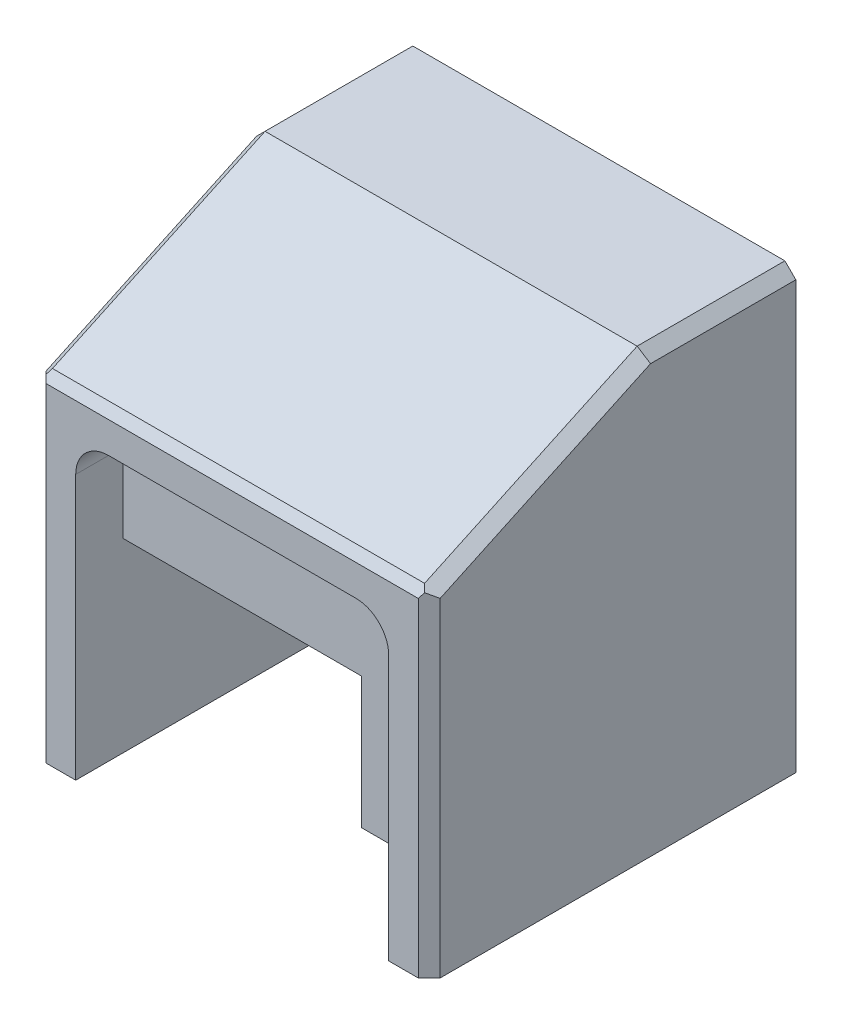
ISO-10303-21;
HEADER;
FILE_DESCRIPTION(('STEP AP214'),'2;1');
FILE_NAME('part.step','',(''),(''),'','','');
FILE_SCHEMA(('AUTOMOTIVE_DESIGN { 1 0 10303 214 1 1 1 1 }'));
ENDSEC;
DATA;
#1=APPLICATION_CONTEXT('core data for automotive mechanical design processes');
#2=APPLICATION_PROTOCOL_DEFINITION('international standard','automotive_design',2000,#1);
#3=PRODUCT_CONTEXT('',#1,'mechanical');
#4=PRODUCT('Part','Part','',(#3));
#5=PRODUCT_RELATED_PRODUCT_CATEGORY('part','',(#4));
#6=PRODUCT_DEFINITION_FORMATION('','',#4);
#7=PRODUCT_DEFINITION_CONTEXT('part definition',#1,'design');
#8=PRODUCT_DEFINITION('design','',#6,#7);
#9=PRODUCT_DEFINITION_SHAPE('','',#8);
#10=(LENGTH_UNIT() NAMED_UNIT(*) SI_UNIT(.MILLI.,.METRE.));
#11=(NAMED_UNIT(*) PLANE_ANGLE_UNIT() SI_UNIT($,.RADIAN.));
#12=(NAMED_UNIT(*) SI_UNIT($,.STERADIAN.) SOLID_ANGLE_UNIT());
#13=UNCERTAINTY_MEASURE_WITH_UNIT(LENGTH_MEASURE(1.E-05),#10,'distance_accuracy_value','');
#14=(GEOMETRIC_REPRESENTATION_CONTEXT(3) GLOBAL_UNCERTAINTY_ASSIGNED_CONTEXT((#13)) GLOBAL_UNIT_ASSIGNED_CONTEXT((#10,
#11,#12)) REPRESENTATION_CONTEXT('',''));
#15=CARTESIAN_POINT('',(0.,0.,0.));
#16=DIRECTION('',(0.,0.,1.));
#17=DIRECTION('',(1.,0.,0.));
#18=AXIS2_PLACEMENT_3D('',#15,#16,#17);
#19=CARTESIAN_POINT('',(0.,31.59892297446,3.));
#20=DIRECTION('',(0.,-0.906307787036659,-0.422618261740681));
#21=DIRECTION('',(0.,0.422618261740681,-0.906307787036659));
#22=AXIS2_PLACEMENT_3D('',#19,#20,#21);
#23=PLANE('',#22);
#24=DIRECTION('',(0.,-0.422618261740681,0.906307787036659));
#25=VECTOR('',#24,1.);
#26=CARTESIAN_POINT('',(-14.3,32.99784594893,0.));
#27=LINE('',#26,#25);
#28=CARTESIAN_POINT('',(-14.3,32.99784594893,0.));
#29=VERTEX_POINT('',#28);
#30=CARTESIAN_POINT('',(-14.3,30.2,6.));
#31=VERTEX_POINT('',#30);
#32=EDGE_CURVE('E411',#29,#31,#27,.T.);
#33=ORIENTED_EDGE('',*,*,#32,.F.);
#34=DIRECTION('',(-1.,0.,0.));
#35=VECTOR('',#34,1.);
#36=CARTESIAN_POINT('',(14.3,32.99784594893,0.));
#37=LINE('',#36,#35);
#38=CARTESIAN_POINT('',(14.3,32.99784594893,0.));
#39=VERTEX_POINT('',#38);
#40=EDGE_CURVE('E345',#39,#29,#37,.T.);
#41=ORIENTED_EDGE('',*,*,#40,.F.);
#42=DIRECTION('',(0.,0.422618261740681,-0.906307787036659));
#43=VECTOR('',#42,1.);
#44=CARTESIAN_POINT('',(14.3,30.2,6.));
#45=LINE('',#44,#43);
#46=CARTESIAN_POINT('',(14.3,30.2,6.));
#47=VERTEX_POINT('',#46);
#48=EDGE_CURVE('E488',#47,#39,#45,.T.);
#49=ORIENTED_EDGE('',*,*,#48,.F.);
#50=DIRECTION('',(-1.,0.,0.));
#51=VECTOR('',#50,1.);
#52=CARTESIAN_POINT('',(14.3,30.2,6.));
#53=LINE('',#52,#51);
#54=EDGE_CURVE('E10',#47,#31,#53,.T.);
#55=ORIENTED_EDGE('',*,*,#54,.T.);
#56=EDGE_LOOP('',(#33,#41,#49,#55));
#57=FACE_BOUND('',#56,.T.);
#58=ADVANCED_FACE('F16',(#57),#23,.T.);
#59=CARTESIAN_POINT('',(-14.3,30.2,0.));
#60=DIRECTION('',(0.,1.,0.));
#61=DIRECTION('',(1.,0.,0.));
#62=AXIS2_PLACEMENT_3D('',#59,#60,#61);
#63=PLANE('',#62);
#64=DIRECTION('',(0.,0.,1.));
#65=VECTOR('',#64,1.);
#66=CARTESIAN_POINT('',(14.3,30.2,6.));
#67=LINE('',#66,#65);
#68=CARTESIAN_POINT('',(14.3,30.2,11.));
#69=VERTEX_POINT('',#68);
#70=EDGE_CURVE('E453',#47,#69,#67,.T.);
#71=ORIENTED_EDGE('',*,*,#70,.T.);
#72=DIRECTION('',(1.,0.,0.));
#73=VECTOR('',#72,1.);
#74=CARTESIAN_POINT('',(-14.3,30.2,11.));
#75=LINE('',#74,#73);
#76=CARTESIAN_POINT('',(-14.3,30.2,11.));
#77=VERTEX_POINT('',#76);
#78=EDGE_CURVE('E542',#77,#69,#75,.T.);
#79=ORIENTED_EDGE('',*,*,#78,.F.);
#80=DIRECTION('',(0.,0.,1.));
#81=VECTOR('',#80,1.);
#82=CARTESIAN_POINT('',(-14.3,30.2,6.));
#83=LINE('',#82,#81);
#84=EDGE_CURVE('E392',#31,#77,#83,.T.);
#85=ORIENTED_EDGE('',*,*,#84,.F.);
#86=ORIENTED_EDGE('',*,*,#54,.F.);
#87=EDGE_LOOP('',(#71,#79,#85,#86));
#88=FACE_BOUND('',#87,.T.);
#89=ADVANCED_FACE('F905',(#88),#63,.F.);
#90=CARTESIAN_POINT('',(0.,25.48993046961,33.21130913087));
#91=DIRECTION('',(0.,0.537299608346801,0.843391445812901));
#92=DIRECTION('',(1.,0.,0.));
#93=AXIS2_PLACEMENT_3D('',#90,#91,#92);
#94=PLANE('',#93);
#95=DIRECTION('',(-0.473306150771121,-0.742941838426434,0.473306150771121));
#96=VECTOR('',#95,1.);
#97=CARTESIAN_POINT('',(-17.,25.94308436313,32.92261826174));
#98=LINE('',#97,#96);
#99=CARTESIAN_POINT('',(-17.,25.94308436313,32.92261826174));
#100=VERTEX_POINT('',#99);
#101=CARTESIAN_POINT('',(-17.28869086913,25.48993046961,33.21130913087));
#102=VERTEX_POINT('',#101);
#103=EDGE_CURVE('E405',#100,#102,#98,.T.);
#104=ORIENTED_EDGE('',*,*,#103,.T.);
#105=DIRECTION('',(0.473306150771121,-0.742941838426434,0.473306150771121));
#106=VECTOR('',#105,1.);
#107=CARTESIAN_POINT('',(-17.28869086913,25.48993046961,33.21130913087));
#108=LINE('',#107,#106);
#109=CARTESIAN_POINT('',(-17.,25.03677657609,33.5));
#110=VERTEX_POINT('',#109);
#111=EDGE_CURVE('E465',#102,#110,#108,.T.);
#112=ORIENTED_EDGE('',*,*,#111,.T.);
#113=DIRECTION('',(-1.,0.,0.));
#114=VECTOR('',#113,1.);
#115=CARTESIAN_POINT('',(17.,25.03677657609,33.5));
#116=LINE('',#115,#114);
#117=CARTESIAN_POINT('',(17.,25.03677657609,33.5));
#118=VERTEX_POINT('',#117);
#119=EDGE_CURVE('E346',#118,#110,#116,.T.);
#120=ORIENTED_EDGE('',*,*,#119,.F.);
#121=DIRECTION('',(0.473306150771121,0.742941838426434,-0.473306150771121));
#122=VECTOR('',#121,1.);
#123=CARTESIAN_POINT('',(17.,25.03677657609,33.5));
#124=LINE('',#123,#122);
#125=CARTESIAN_POINT('',(17.28869086913,25.48993046961,33.21130913087));
#126=VERTEX_POINT('',#125);
#127=EDGE_CURVE('E420',#118,#126,#124,.T.);
#128=ORIENTED_EDGE('',*,*,#127,.T.);
#129=DIRECTION('',(0.473306150771121,-0.742941838426434,0.473306150771121));
#130=VECTOR('',#129,1.);
#131=CARTESIAN_POINT('',(17.,25.94308436313,32.92261826174));
#132=LINE('',#131,#130);
#133=CARTESIAN_POINT('',(17.,25.94308436313,32.92261826174));
#134=VERTEX_POINT('',#133);
#135=EDGE_CURVE('E25',#134,#126,#132,.T.);
#136=ORIENTED_EDGE('',*,*,#135,.F.);
#137=DIRECTION('',(-1.,0.,0.));
#138=VECTOR('',#137,1.);
#139=CARTESIAN_POINT('',(17.,25.94308436313,32.92261826174));
#140=LINE('',#139,#138);
#141=EDGE_CURVE('E44',#134,#100,#140,.T.);
#142=ORIENTED_EDGE('',*,*,#141,.T.);
#143=EDGE_LOOP('',(#104,#112,#120,#128,#136,#142));
#144=FACE_BOUND('',#143,.T.);
#145=ADVANCED_FACE('F636',(#144),#94,.T.);
#146=CARTESIAN_POINT('',(17.5,29.88376952493,23.28869086913));
#147=DIRECTION('',(0.707106781186523,0.640856382055821,0.298836238730109));
#148=DIRECTION('',(0.,0.422618261740671,-0.906307787036664));
#149=AXIS2_PLACEMENT_3D('',#146,#147,#148);
#150=PLANE('',#149);
#151=ORIENTED_EDGE('',*,*,#135,.T.);
#152=DIRECTION('',(0.644710818692427,-0.410726089409818,-0.644710818692427));
#153=VECTOR('',#152,1.);
#154=CARTESIAN_POINT('',(17.28869086913,25.48993046961,33.21130913087));
#155=LINE('',#154,#153);
#156=CARTESIAN_POINT('',(18.,25.03677657609,32.5));
#157=VERTEX_POINT('',#156);
#158=EDGE_CURVE('E424',#126,#157,#155,.T.);
#159=ORIENTED_EDGE('',*,*,#158,.T.);
#160=DIRECTION('',(0.,-0.422618261740681,0.906307787036659));
#161=VECTOR('',#160,1.);
#162=CARTESIAN_POINT('',(18.,34.,13.27830533736));
#163=LINE('',#162,#161);
#164=CARTESIAN_POINT('',(18.,34.,13.27830533736));
#165=VERTEX_POINT('',#164);
#166=EDGE_CURVE('E415',#165,#157,#163,.T.);
#167=ORIENTED_EDGE('',*,*,#166,.F.);
#168=DIRECTION('',(0.698575389024277,-0.698575389024277,-0.154870435200395));
#169=VECTOR('',#168,1.);
#170=CARTESIAN_POINT('',(17.,35.,13.5));
#171=LINE('',#170,#169);
#172=CARTESIAN_POINT('',(17.,35.,13.5));
#173=VERTEX_POINT('',#172);
#174=EDGE_CURVE('E290',#173,#165,#171,.T.);
#175=ORIENTED_EDGE('',*,*,#174,.F.);
#176=DIRECTION('',(0.,-0.422618261740681,0.906307787036659));
#177=VECTOR('',#176,1.);
#178=CARTESIAN_POINT('',(17.,35.,13.5));
#179=LINE('',#178,#177);
#180=EDGE_CURVE('E476',#173,#134,#179,.T.);
#181=ORIENTED_EDGE('',*,*,#180,.T.);
#182=EDGE_LOOP('',(#151,#159,#167,#175,#181));
#183=FACE_BOUND('',#182,.T.);
#184=ADVANCED_FACE('F646',(#183),#150,.T.);
#185=CARTESIAN_POINT('',(0.,30.33692341845,23.5));
#186=DIRECTION('',(0.,0.906307787036659,0.422618261740681));
#187=DIRECTION('',(1.,0.,0.));
#188=AXIS2_PLACEMENT_3D('',#185,#186,#187);
#189=PLANE('',#188);
#190=ORIENTED_EDGE('',*,*,#141,.F.);
#191=ORIENTED_EDGE('',*,*,#180,.F.);
#192=DIRECTION('',(-1.,0.,0.));
#193=VECTOR('',#192,1.);
#194=CARTESIAN_POINT('',(17.,35.,13.5));
#195=LINE('',#194,#193);
#196=CARTESIAN_POINT('',(-17.,35.,13.5));
#197=VERTEX_POINT('',#196);
#198=EDGE_CURVE('E286',#173,#197,#195,.T.);
#199=ORIENTED_EDGE('',*,*,#198,.T.);
#200=DIRECTION('',(0.,0.422618261740719,-0.906307787036641));
#201=VECTOR('',#200,1.);
#202=CARTESIAN_POINT('',(-17.,25.94308436313,32.92261826174));
#203=LINE('',#202,#201);
#204=EDGE_CURVE('E19',#100,#197,#203,.T.);
#205=ORIENTED_EDGE('',*,*,#204,.F.);
#206=EDGE_LOOP('',(#190,#191,#199,#205));
#207=FACE_BOUND('',#206,.T.);
#208=ADVANCED_FACE('F649',(#207),#189,.T.);
#209=CARTESIAN_POINT('',(-17.5,29.88376952493,23.28869086913));
#210=DIRECTION('',(-0.707106781186523,0.640856382055821,0.298836238730109));
#211=DIRECTION('',(0.389281620635025,0.,0.921118787038766));
#212=AXIS2_PLACEMENT_3D('',#209,#210,#211);
#213=PLANE('',#212);
#214=DIRECTION('',(0.644710818692427,0.410726089409818,0.644710818692427));
#215=VECTOR('',#214,1.);
#216=CARTESIAN_POINT('',(-18.,25.03677657609,32.5));
#217=LINE('',#216,#215);
#218=CARTESIAN_POINT('',(-18.,25.03677657609,32.5));
#219=VERTEX_POINT('',#218);
#220=EDGE_CURVE('E557',#219,#102,#217,.T.);
#221=ORIENTED_EDGE('',*,*,#220,.T.);
#222=ORIENTED_EDGE('',*,*,#103,.F.);
#223=ORIENTED_EDGE('',*,*,#204,.T.);
#224=DIRECTION('',(-0.698575389024277,-0.698575389024277,-0.154870435200395));
#225=VECTOR('',#224,1.);
#226=CARTESIAN_POINT('',(-17.,35.,13.5));
#227=LINE('',#226,#225);
#228=CARTESIAN_POINT('',(-18.,34.,13.27830533736));
#229=VERTEX_POINT('',#228);
#230=EDGE_CURVE('E371',#197,#229,#227,.T.);
#231=ORIENTED_EDGE('',*,*,#230,.T.);
#232=DIRECTION('',(0.,0.422618261740681,-0.906307787036659));
#233=VECTOR('',#232,1.);
#234=CARTESIAN_POINT('',(-18.,25.03677657609,32.5));
#235=LINE('',#234,#233);
#236=EDGE_CURVE('E408',#219,#229,#235,.T.);
#237=ORIENTED_EDGE('',*,*,#236,.F.);
#238=EDGE_LOOP('',(#221,#222,#223,#231,#237));
#239=FACE_BOUND('',#238,.T.);
#240=ADVANCED_FACE('F624',(#239),#213,.T.);
#241=CARTESIAN_POINT('',(-18.,35.,0.));
#242=DIRECTION('',(-1.,0.,0.));
#243=DIRECTION('',(0.,0.,1.));
#244=AXIS2_PLACEMENT_3D('',#241,#242,#243);
#245=PLANE('',#244);
#246=ORIENTED_EDGE('',*,*,#236,.T.);
#247=DIRECTION('',(0.,0.,-1.));
#248=VECTOR('',#247,1.);
#249=CARTESIAN_POINT('',(-18.,34.,13.27830533736));
#250=LINE('',#249,#248);
#251=CARTESIAN_POINT('',(-18.,34.,0.));
#252=VERTEX_POINT('',#251);
#253=EDGE_CURVE('E376',#229,#252,#250,.T.);
#254=ORIENTED_EDGE('',*,*,#253,.T.);
#255=DIRECTION('',(0.,1.,0.));
#256=VECTOR('',#255,1.);
#257=CARTESIAN_POINT('',(-18.,-5.,0.));
#258=LINE('',#257,#256);
#259=CARTESIAN_POINT('',(-18.,-5.,0.));
#260=VERTEX_POINT('',#259);
#261=EDGE_CURVE('E356',#260,#252,#258,.T.);
#262=ORIENTED_EDGE('',*,*,#261,.F.);
#263=DIRECTION('',(0.,0.,-1.));
#264=VECTOR('',#263,1.);
#265=CARTESIAN_POINT('',(-18.,-5.,32.5));
#266=LINE('',#265,#264);
#267=CARTESIAN_POINT('',(-18.,-5.,32.5));
#268=VERTEX_POINT('',#267);
#269=EDGE_CURVE('E444',#268,#260,#266,.T.);
#270=ORIENTED_EDGE('',*,*,#269,.F.);
#271=DIRECTION('',(0.,1.,0.));
#272=VECTOR('',#271,1.);
#273=CARTESIAN_POINT('',(-18.,-5.,32.5));
#274=LINE('',#273,#272);
#275=EDGE_CURVE('E561',#268,#219,#274,.T.);
#276=ORIENTED_EDGE('',*,*,#275,.T.);
#277=EDGE_LOOP('',(#246,#254,#262,#270,#276));
#278=FACE_BOUND('',#277,.T.);
#279=ADVANCED_FACE('F617',(#278),#245,.T.);
#280=CARTESIAN_POINT('',(-17.5,10.33692341845,33.));
#281=DIRECTION('',(-0.707106781186548,0.,0.707106781186548));
#282=DIRECTION('',(0.,1.,0.));
#283=AXIS2_PLACEMENT_3D('',#280,#281,#282);
#284=PLANE('',#283);
#285=DIRECTION('',(0.,1.,0.));
#286=VECTOR('',#285,1.);
#287=CARTESIAN_POINT('',(-17.,-5.,33.5));
#288=LINE('',#287,#286);
#289=CARTESIAN_POINT('',(-17.,-5.,33.5));
#290=VERTEX_POINT('',#289);
#291=EDGE_CURVE('E350',#290,#110,#288,.T.);
#292=ORIENTED_EDGE('',*,*,#291,.T.);
#293=ORIENTED_EDGE('',*,*,#111,.F.);
#294=ORIENTED_EDGE('',*,*,#220,.F.);
#295=ORIENTED_EDGE('',*,*,#275,.F.);
#296=DIRECTION('',(-0.707106781186548,0.,-0.707106781186548));
#297=VECTOR('',#296,1.);
#298=CARTESIAN_POINT('',(-17.,-5.,33.5));
#299=LINE('',#298,#297);
#300=EDGE_CURVE('E469',#290,#268,#299,.T.);
#301=ORIENTED_EDGE('',*,*,#300,.F.);
#302=EDGE_LOOP('',(#292,#293,#294,#295,#301));
#303=FACE_BOUND('',#302,.T.);
#304=ADVANCED_FACE('F634',(#303),#284,.T.);
#305=CARTESIAN_POINT('',(-14.3,22.2,29.2));
#306=DIRECTION('',(0.,-1.,0.));
#307=DIRECTION('',(0.,0.,-1.));
#308=AXIS2_PLACEMENT_3D('',#305,#306,#307);
#309=PLANE('',#308);
#310=DIRECTION('',(1.,0.,0.));
#311=VECTOR('',#310,1.);
#312=CARTESIAN_POINT('',(-11.3,22.2,33.5));
#313=LINE('',#312,#311);
#314=CARTESIAN_POINT('',(-11.3,22.2,33.5));
#315=VERTEX_POINT('',#314);
#316=CARTESIAN_POINT('',(11.3,22.2,33.5));
#317=VERTEX_POINT('',#316);
#318=EDGE_CURVE('E535',#315,#317,#313,.T.);
#319=ORIENTED_EDGE('',*,*,#318,.F.);
#320=DIRECTION('',(0.,0.,1.));
#321=VECTOR('',#320,1.);
#322=CARTESIAN_POINT('',(-11.3,22.2,29.2));
#323=LINE('',#322,#321);
#324=CARTESIAN_POINT('',(-11.3,22.2,29.2));
#325=VERTEX_POINT('',#324);
#326=EDGE_CURVE('E462',#325,#315,#323,.T.);
#327=ORIENTED_EDGE('',*,*,#326,.F.);
#328=DIRECTION('',(1.,0.,0.));
#329=VECTOR('',#328,1.);
#330=CARTESIAN_POINT('',(-11.3,22.2,29.2));
#331=LINE('',#330,#329);
#332=CARTESIAN_POINT('',(11.3,22.2,29.2));
#333=VERTEX_POINT('',#332);
#334=EDGE_CURVE('E573',#325,#333,#331,.T.);
#335=ORIENTED_EDGE('',*,*,#334,.T.);
#336=DIRECTION('',(0.,0.,1.));
#337=VECTOR('',#336,1.);
#338=CARTESIAN_POINT('',(11.3,22.2,29.2));
#339=LINE('',#338,#337);
#340=EDGE_CURVE('E493',#333,#317,#339,.T.);
#341=ORIENTED_EDGE('',*,*,#340,.T.);
#342=EDGE_LOOP('',(#319,#327,#335,#341));
#343=FACE_BOUND('',#342,.T.);
#344=ADVANCED_FACE('F840',(#343),#309,.T.);
#345=CARTESIAN_POINT('',(-11.3,19.2,-43.6706));
#346=DIRECTION('',(0.,0.,1.));
#347=DIRECTION('',(0.,1.,0.));
#348=AXIS2_PLACEMENT_3D('',#345,#346,#347);
#349=CYLINDRICAL_SURFACE('',#348,3.);
#350=CARTESIAN_POINT('',(-11.3,19.2,33.5));
#351=DIRECTION('',(0.,0.,-1.));
#352=DIRECTION('',(-1.,0.,0.));
#353=AXIS2_PLACEMENT_3D('',#350,#351,#352);
#354=CIRCLE('',#353,3.);
#355=CARTESIAN_POINT('',(-14.3,19.2,33.5));
#356=VERTEX_POINT('',#355);
#357=EDGE_CURVE('E582',#356,#315,#354,.T.);
#358=ORIENTED_EDGE('',*,*,#357,.F.);
#359=DIRECTION('',(0.,0.,1.));
#360=VECTOR('',#359,1.);
#361=CARTESIAN_POINT('',(-14.3,19.2,29.2));
#362=LINE('',#361,#360);
#363=CARTESIAN_POINT('',(-14.3,19.2,29.2));
#364=VERTEX_POINT('',#363);
#365=EDGE_CURVE('E513',#364,#356,#362,.T.);
#366=ORIENTED_EDGE('',*,*,#365,.F.);
#367=CARTESIAN_POINT('',(-11.3,19.2,29.2));
#368=DIRECTION('',(0.,0.,1.));
#369=DIRECTION('',(0.,1.,0.));
#370=AXIS2_PLACEMENT_3D('',#367,#368,#369);
#371=CIRCLE('',#370,3.);
#372=EDGE_CURVE('E529',#325,#364,#371,.T.);
#373=ORIENTED_EDGE('',*,*,#372,.F.);
#374=ORIENTED_EDGE('',*,*,#326,.T.);
#375=EDGE_LOOP('',(#358,#366,#373,#374));
#376=FACE_BOUND('',#375,.T.);
#377=ADVANCED_FACE('F863',(#376),#349,.F.);
#378=CARTESIAN_POINT('',(-14.3,0.,17.2));
#379=DIRECTION('',(0.,0.,-1.));
#380=DIRECTION('',(0.,-1.,0.));
#381=AXIS2_PLACEMENT_3D('',#378,#379,#380);
#382=PLANE('',#381);
#383=DIRECTION('',(0.,1.,0.));
#384=VECTOR('',#383,1.);
#385=CARTESIAN_POINT('',(-7.5,0.,17.2));
#386=LINE('',#385,#384);
#387=CARTESIAN_POINT('',(-7.5,0.,17.2));
#388=VERTEX_POINT('',#387);
#389=CARTESIAN_POINT('',(-7.5,12.,17.2));
#390=VERTEX_POINT('',#389);
#391=EDGE_CURVE('E448',#388,#390,#386,.T.);
#392=ORIENTED_EDGE('',*,*,#391,.T.);
#393=DIRECTION('',(1.,0.,0.));
#394=VECTOR('',#393,1.);
#395=CARTESIAN_POINT('',(-14.3,12.,17.2));
#396=LINE('',#395,#394);
#397=CARTESIAN_POINT('',(-14.3,12.,17.2));
#398=VERTEX_POINT('',#397);
#399=EDGE_CURVE('E328',#398,#390,#396,.T.);
#400=ORIENTED_EDGE('',*,*,#399,.F.);
#401=DIRECTION('',(0.,1.,0.));
#402=VECTOR('',#401,1.);
#403=CARTESIAN_POINT('',(-14.3,0.,17.2));
#404=LINE('',#403,#402);
#405=CARTESIAN_POINT('',(-14.3,0.,17.2));
#406=VERTEX_POINT('',#405);
#407=EDGE_CURVE('E387',#406,#398,#404,.T.);
#408=ORIENTED_EDGE('',*,*,#407,.F.);
#409=DIRECTION('',(1.,0.,0.));
#410=VECTOR('',#409,1.);
#411=CARTESIAN_POINT('',(-14.3,0.,17.2));
#412=LINE('',#411,#410);
#413=EDGE_CURVE('E365',#406,#388,#412,.T.);
#414=ORIENTED_EDGE('',*,*,#413,.T.);
#415=EDGE_LOOP('',(#392,#400,#408,#414));
#416=FACE_BOUND('',#415,.T.);
#417=ADVANCED_FACE('F811',(#416),#382,.F.);
#418=CARTESIAN_POINT('',(-7.5,12.,29.2));
#419=DIRECTION('',(-1.,0.,0.));
#420=DIRECTION('',(0.,0.,1.));
#421=AXIS2_PLACEMENT_3D('',#418,#419,#420);
#422=PLANE('',#421);
#423=DIRECTION('',(0.,0.,1.));
#424=VECTOR('',#423,1.);
#425=CARTESIAN_POINT('',(-7.5,0.,11.));
#426=LINE('',#425,#424);
#427=CARTESIAN_POINT('',(-7.5,0.,11.));
#428=VERTEX_POINT('',#427);
#429=EDGE_CURVE('E396',#428,#388,#426,.T.);
#430=ORIENTED_EDGE('',*,*,#429,.F.);
#431=DIRECTION('',(0.,-1.,0.));
#432=VECTOR('',#431,1.);
#433=CARTESIAN_POINT('',(-7.5,29.,11.));
#434=LINE('',#433,#432);
#435=CARTESIAN_POINT('',(-7.5,29.,11.));
#436=VERTEX_POINT('',#435);
#437=EDGE_CURVE('E550',#436,#428,#434,.T.);
#438=ORIENTED_EDGE('',*,*,#437,.F.);
#439=DIRECTION('',(0.,-0.707106781186548,0.707106781186548));
#440=VECTOR('',#439,1.);
#441=CARTESIAN_POINT('',(-7.5,29.,11.));
#442=LINE('',#441,#440);
#443=CARTESIAN_POINT('',(-7.5,12.,28.));
#444=VERTEX_POINT('',#443);
#445=EDGE_CURVE('E520',#436,#444,#442,.T.);
#446=ORIENTED_EDGE('',*,*,#445,.T.);
#447=DIRECTION('',(0.,0.,-1.));
#448=VECTOR('',#447,1.);
#449=CARTESIAN_POINT('',(-7.5,12.,28.));
#450=LINE('',#449,#448);
#451=EDGE_CURVE('E332',#444,#390,#450,.T.);
#452=ORIENTED_EDGE('',*,*,#451,.T.);
#453=ORIENTED_EDGE('',*,*,#391,.F.);
#454=EDGE_LOOP('',(#430,#438,#446,#452,#453));
#455=FACE_BOUND('',#454,.T.);
#456=ADVANCED_FACE('F805',(#455),#422,.F.);
#457=CARTESIAN_POINT('',(7.5,12.,29.2));
#458=DIRECTION('',(0.,1.,0.));
#459=DIRECTION('',(1.,0.,0.));
#460=AXIS2_PLACEMENT_3D('',#457,#458,#459);
#461=PLANE('',#460);
#462=ORIENTED_EDGE('',*,*,#399,.T.);
#463=ORIENTED_EDGE('',*,*,#451,.F.);
#464=DIRECTION('',(-1.,0.,0.));
#465=VECTOR('',#464,1.);
#466=CARTESIAN_POINT('',(7.5,12.,28.));
#467=LINE('',#466,#465);
#468=CARTESIAN_POINT('',(7.5,12.,28.));
#469=VERTEX_POINT('',#468);
#470=EDGE_CURVE('E333',#469,#444,#467,.T.);
#471=ORIENTED_EDGE('',*,*,#470,.F.);
#472=DIRECTION('',(0.,0.,-1.));
#473=VECTOR('',#472,1.);
#474=CARTESIAN_POINT('',(7.5,12.,29.2));
#475=LINE('',#474,#473);
#476=CARTESIAN_POINT('',(7.5,12.,29.2));
#477=VERTEX_POINT('',#476);
#478=EDGE_CURVE('E597',#477,#469,#475,.T.);
#479=ORIENTED_EDGE('',*,*,#478,.F.);
#480=DIRECTION('',(1.,0.,0.));
#481=VECTOR('',#480,1.);
#482=CARTESIAN_POINT('',(-14.3,12.,29.2));
#483=LINE('',#482,#481);
#484=CARTESIAN_POINT('',(-14.3,12.,29.2));
#485=VERTEX_POINT('',#484);
#486=EDGE_CURVE('E524',#485,#477,#483,.T.);
#487=ORIENTED_EDGE('',*,*,#486,.F.);
#488=DIRECTION('',(0.,0.,-1.));
#489=VECTOR('',#488,1.);
#490=CARTESIAN_POINT('',(-14.3,12.,29.2));
#491=LINE('',#490,#489);
#492=EDGE_CURVE('E391',#485,#398,#491,.T.);
#493=ORIENTED_EDGE('',*,*,#492,.T.);
#494=EDGE_LOOP('',(#462,#463,#471,#479,#487,#493));
#495=FACE_BOUND('',#494,.T.);
#496=ADVANCED_FACE('F810',(#495),#461,.F.);
#497=CARTESIAN_POINT('',(0.,20.5,19.5));
#498=DIRECTION('',(0.,-0.707106781186548,-0.707106781186548));
#499=DIRECTION('',(0.,-0.707106781186548,0.707106781186548));
#500=AXIS2_PLACEMENT_3D('',#497,#498,#499);
#501=PLANE('',#500);
#502=ORIENTED_EDGE('',*,*,#445,.F.);
#503=DIRECTION('',(-1.,0.,0.));
#504=VECTOR('',#503,1.);
#505=CARTESIAN_POINT('',(7.5,29.,11.));
#506=LINE('',#505,#504);
#507=CARTESIAN_POINT('',(7.5,29.,11.));
#508=VERTEX_POINT('',#507);
#509=EDGE_CURVE('E546',#508,#436,#506,.T.);
#510=ORIENTED_EDGE('',*,*,#509,.F.);
#511=DIRECTION('',(0.,0.707106781186548,-0.707106781186548));
#512=VECTOR('',#511,1.);
#513=CARTESIAN_POINT('',(7.5,12.,28.));
#514=LINE('',#513,#512);
#515=EDGE_CURVE('E601',#469,#508,#514,.T.);
#516=ORIENTED_EDGE('',*,*,#515,.F.);
#517=ORIENTED_EDGE('',*,*,#470,.T.);
#518=EDGE_LOOP('',(#502,#510,#516,#517));
#519=FACE_BOUND('',#518,.T.);
#520=ADVANCED_FACE('F830',(#519),#501,.T.);
#521=CARTESIAN_POINT('',(7.5,0.,29.2));
#522=DIRECTION('',(1.,0.,0.));
#523=DIRECTION('',(0.,1.,0.));
#524=AXIS2_PLACEMENT_3D('',#521,#522,#523);
#525=PLANE('',#524);
#526=DIRECTION('',(0.,0.,1.));
#527=VECTOR('',#526,1.);
#528=CARTESIAN_POINT('',(7.5,0.,23.));
#529=LINE('',#528,#527);
#530=CARTESIAN_POINT('',(7.5,0.,23.));
#531=VERTEX_POINT('',#530);
#532=CARTESIAN_POINT('',(7.5,0.,29.2));
#533=VERTEX_POINT('',#532);
#534=EDGE_CURVE('E336',#531,#533,#529,.T.);
#535=ORIENTED_EDGE('',*,*,#534,.T.);
#536=DIRECTION('',(0.,1.,0.));
#537=VECTOR('',#536,1.);
#538=CARTESIAN_POINT('',(7.5,0.,29.2));
#539=LINE('',#538,#537);
#540=EDGE_CURVE('E528',#533,#477,#539,.T.);
#541=ORIENTED_EDGE('',*,*,#540,.T.);
#542=ORIENTED_EDGE('',*,*,#478,.T.);
#543=ORIENTED_EDGE('',*,*,#515,.T.);
#544=DIRECTION('',(0.,1.,0.));
#545=VECTOR('',#544,1.);
#546=CARTESIAN_POINT('',(7.5,12.,11.));
#547=LINE('',#546,#545);
#548=CARTESIAN_POINT('',(7.5,12.,11.));
#549=VERTEX_POINT('',#548);
#550=EDGE_CURVE('E545',#549,#508,#547,.T.);
#551=ORIENTED_EDGE('',*,*,#550,.F.);
#552=DIRECTION('',(0.,0.,1.));
#553=VECTOR('',#552,1.);
#554=CARTESIAN_POINT('',(7.5,12.,11.));
#555=LINE('',#554,#553);
#556=CARTESIAN_POINT('',(7.5,12.,23.));
#557=VERTEX_POINT('',#556);
#558=EDGE_CURVE('E317',#549,#557,#555,.T.);
#559=ORIENTED_EDGE('',*,*,#558,.T.);
#560=DIRECTION('',(0.,1.,0.));
#561=VECTOR('',#560,1.);
#562=CARTESIAN_POINT('',(7.5,0.,23.));
#563=LINE('',#562,#561);
#564=EDGE_CURVE('E318',#531,#557,#563,.T.);
#565=ORIENTED_EDGE('',*,*,#564,.F.);
#566=EDGE_LOOP('',(#535,#541,#542,#543,#551,#559,#565));
#567=FACE_BOUND('',#566,.T.);
#568=ADVANCED_FACE('F821',(#567),#525,.F.);
#569=CARTESIAN_POINT('',(0.,0.,29.2));
#570=DIRECTION('',(0.,0.,1.));
#571=DIRECTION('',(1.,0.,0.));
#572=AXIS2_PLACEMENT_3D('',#569,#570,#571);
#573=PLANE('',#572);
#574=DIRECTION('',(0.,1.,0.));
#575=VECTOR('',#574,1.);
#576=CARTESIAN_POINT('',(14.3,0.,29.2));
#577=LINE('',#576,#575);
#578=CARTESIAN_POINT('',(14.3,0.,29.2));
#579=VERTEX_POINT('',#578);
#580=CARTESIAN_POINT('',(14.3,19.2,29.2));
#581=VERTEX_POINT('',#580);
#582=EDGE_CURVE('E385',#579,#581,#577,.T.);
#583=ORIENTED_EDGE('',*,*,#582,.T.);
#584=CARTESIAN_POINT('',(11.3,19.2,29.2));
#585=DIRECTION('',(0.,0.,1.));
#586=DIRECTION('',(1.,0.,0.));
#587=AXIS2_PLACEMENT_3D('',#584,#585,#586);
#588=CIRCLE('',#587,3.);
#589=EDGE_CURVE('E496',#581,#333,#588,.T.);
#590=ORIENTED_EDGE('',*,*,#589,.T.);
#591=ORIENTED_EDGE('',*,*,#334,.F.);
#592=ORIENTED_EDGE('',*,*,#372,.T.);
#593=DIRECTION('',(0.,1.,0.));
#594=VECTOR('',#593,1.);
#595=CARTESIAN_POINT('',(-14.3,12.,29.2));
#596=LINE('',#595,#594);
#597=EDGE_CURVE('E509',#485,#364,#596,.T.);
#598=ORIENTED_EDGE('',*,*,#597,.F.);
#599=ORIENTED_EDGE('',*,*,#486,.T.);
#600=ORIENTED_EDGE('',*,*,#540,.F.);
#601=DIRECTION('',(1.,0.,0.));
#602=VECTOR('',#601,1.);
#603=CARTESIAN_POINT('',(7.5,0.,29.2));
#604=LINE('',#603,#602);
#605=EDGE_CURVE('E341',#533,#579,#604,.T.);
#606=ORIENTED_EDGE('',*,*,#605,.T.);
#607=EDGE_LOOP('',(#583,#590,#591,#592,#598,#599,#600,#606));
#608=FACE_BOUND('',#607,.T.);
#609=ADVANCED_FACE('F799',(#608),#573,.T.);
#610=CARTESIAN_POINT('',(11.3,19.2,-43.6706));
#611=DIRECTION('',(0.,0.,1.));
#612=DIRECTION('',(1.,0.,0.));
#613=AXIS2_PLACEMENT_3D('',#610,#611,#612);
#614=CYLINDRICAL_SURFACE('',#613,3.);
#615=CARTESIAN_POINT('',(11.3,19.2,33.5));
#616=DIRECTION('',(0.,0.,-1.));
#617=DIRECTION('',(0.,1.,0.));
#618=AXIS2_PLACEMENT_3D('',#615,#616,#617);
#619=CIRCLE('',#618,3.);
#620=CARTESIAN_POINT('',(14.3,19.2,33.5));
#621=VERTEX_POINT('',#620);
#622=EDGE_CURVE('E497',#317,#621,#619,.T.);
#623=ORIENTED_EDGE('',*,*,#622,.F.);
#624=ORIENTED_EDGE('',*,*,#340,.F.);
#625=ORIENTED_EDGE('',*,*,#589,.F.);
#626=DIRECTION('',(0.,0.,1.));
#627=VECTOR('',#626,1.);
#628=CARTESIAN_POINT('',(14.3,19.2,29.2));
#629=LINE('',#628,#627);
#630=EDGE_CURVE('E397',#581,#621,#629,.T.);
#631=ORIENTED_EDGE('',*,*,#630,.T.);
#632=EDGE_LOOP('',(#623,#624,#625,#631));
#633=FACE_BOUND('',#632,.T.);
#634=ADVANCED_FACE('F791',(#633),#614,.F.);
#635=CARTESIAN_POINT('',(0.,0.,33.5));
#636=DIRECTION('',(0.,0.,1.));
#637=DIRECTION('',(1.,0.,0.));
#638=AXIS2_PLACEMENT_3D('',#635,#636,#637);
#639=PLANE('',#638);
#640=ORIENTED_EDGE('',*,*,#119,.T.);
#641=ORIENTED_EDGE('',*,*,#291,.F.);
#642=DIRECTION('',(-1.,0.,0.));
#643=VECTOR('',#642,1.);
#644=CARTESIAN_POINT('',(-14.3,-5.,33.5));
#645=LINE('',#644,#643);
#646=CARTESIAN_POINT('',(-14.3,-5.,33.5));
#647=VERTEX_POINT('',#646);
#648=EDGE_CURVE('E461',#647,#290,#645,.T.);
#649=ORIENTED_EDGE('',*,*,#648,.F.);
#650=DIRECTION('',(0.,1.,0.));
#651=VECTOR('',#650,1.);
#652=CARTESIAN_POINT('',(-14.3,-5.,33.5));
#653=LINE('',#652,#651);
#654=EDGE_CURVE('E351',#647,#356,#653,.T.);
#655=ORIENTED_EDGE('',*,*,#654,.T.);
#656=ORIENTED_EDGE('',*,*,#357,.T.);
#657=ORIENTED_EDGE('',*,*,#318,.T.);
#658=ORIENTED_EDGE('',*,*,#622,.T.);
#659=DIRECTION('',(0.,-1.,0.));
#660=VECTOR('',#659,1.);
#661=CARTESIAN_POINT('',(14.3,19.2,33.5));
#662=LINE('',#661,#660);
#663=CARTESIAN_POINT('',(14.3,-5.,33.5));
#664=VERTEX_POINT('',#663);
#665=EDGE_CURVE('E401',#621,#664,#662,.T.);
#666=ORIENTED_EDGE('',*,*,#665,.T.);
#667=DIRECTION('',(-1.,0.,0.));
#668=VECTOR('',#667,1.);
#669=CARTESIAN_POINT('',(17.,-5.,33.5));
#670=LINE('',#669,#668);
#671=CARTESIAN_POINT('',(17.,-5.,33.5));
#672=VERTEX_POINT('',#671);
#673=EDGE_CURVE('E437',#672,#664,#670,.T.);
#674=ORIENTED_EDGE('',*,*,#673,.F.);
#675=DIRECTION('',(0.,1.,0.));
#676=VECTOR('',#675,1.);
#677=CARTESIAN_POINT('',(17.,-5.,33.5));
#678=LINE('',#677,#676);
#679=EDGE_CURVE('E423',#672,#118,#678,.T.);
#680=ORIENTED_EDGE('',*,*,#679,.T.);
#681=EDGE_LOOP('',(#640,#641,#649,#655,#656,#657,#658,#666,#674,#680));
#682=FACE_BOUND('',#681,.T.);
#683=ADVANCED_FACE('F641',(#682),#639,.T.);
#684=CARTESIAN_POINT('',(-14.3,0.,0.));
#685=DIRECTION('',(1.,0.,0.));
#686=DIRECTION('',(0.,1.,0.));
#687=AXIS2_PLACEMENT_3D('',#684,#685,#686);
#688=PLANE('',#687);
#689=DIRECTION('',(0.,0.,1.));
#690=VECTOR('',#689,1.);
#691=CARTESIAN_POINT('',(-14.3,-5.,0.));
#692=LINE('',#691,#690);
#693=CARTESIAN_POINT('',(-14.3,-5.,0.));
#694=VERTEX_POINT('',#693);
#695=EDGE_CURVE('E457',#694,#647,#692,.T.);
#696=ORIENTED_EDGE('',*,*,#695,.F.);
#697=DIRECTION('',(0.,-1.,0.));
#698=VECTOR('',#697,1.);
#699=CARTESIAN_POINT('',(-14.3,32.99784594893,0.));
#700=LINE('',#699,#698);
#701=EDGE_CURVE('E357',#29,#694,#700,.T.);
#702=ORIENTED_EDGE('',*,*,#701,.F.);
#703=ORIENTED_EDGE('',*,*,#32,.T.);
#704=ORIENTED_EDGE('',*,*,#84,.T.);
#705=DIRECTION('',(0.,-1.,0.));
#706=VECTOR('',#705,1.);
#707=CARTESIAN_POINT('',(-14.3,30.2,11.));
#708=LINE('',#707,#706);
#709=CARTESIAN_POINT('',(-14.3,0.,11.));
#710=VERTEX_POINT('',#709);
#711=EDGE_CURVE('E556',#77,#710,#708,.T.);
#712=ORIENTED_EDGE('',*,*,#711,.T.);
#713=DIRECTION('',(0.,0.,1.));
#714=VECTOR('',#713,1.);
#715=CARTESIAN_POINT('',(-14.3,0.,11.));
#716=LINE('',#715,#714);
#717=EDGE_CURVE('E361',#710,#406,#716,.T.);
#718=ORIENTED_EDGE('',*,*,#717,.T.);
#719=ORIENTED_EDGE('',*,*,#407,.T.);
#720=ORIENTED_EDGE('',*,*,#492,.F.);
#721=ORIENTED_EDGE('',*,*,#597,.T.);
#722=ORIENTED_EDGE('',*,*,#365,.T.);
#723=ORIENTED_EDGE('',*,*,#654,.F.);
#724=EDGE_LOOP('',(#696,#702,#703,#704,#712,#718,#719,#720,#721,#722,#723));
#725=FACE_BOUND('',#724,.T.);
#726=ADVANCED_FACE('F719',(#725),#688,.T.);
#727=CARTESIAN_POINT('',(-14.3,30.2,11.));
#728=DIRECTION('',(0.,0.,1.));
#729=DIRECTION('',(1.,0.,0.));
#730=AXIS2_PLACEMENT_3D('',#727,#728,#729);
#731=PLANE('',#730);
#732=ORIENTED_EDGE('',*,*,#78,.T.);
#733=DIRECTION('',(0.,-1.,0.));
#734=VECTOR('',#733,1.);
#735=CARTESIAN_POINT('',(14.3,30.2,11.));
#736=LINE('',#735,#734);
#737=CARTESIAN_POINT('',(14.3,12.,11.));
#738=VERTEX_POINT('',#737);
#739=EDGE_CURVE('E449',#69,#738,#736,.T.);
#740=ORIENTED_EDGE('',*,*,#739,.T.);
#741=DIRECTION('',(-1.,0.,0.));
#742=VECTOR('',#741,1.);
#743=CARTESIAN_POINT('',(14.3,12.,11.));
#744=LINE('',#743,#742);
#745=EDGE_CURVE('E538',#738,#549,#744,.T.);
#746=ORIENTED_EDGE('',*,*,#745,.T.);
#747=ORIENTED_EDGE('',*,*,#550,.T.);
#748=ORIENTED_EDGE('',*,*,#509,.T.);
#749=ORIENTED_EDGE('',*,*,#437,.T.);
#750=DIRECTION('',(1.,0.,0.));
#751=VECTOR('',#750,1.);
#752=CARTESIAN_POINT('',(-14.3,0.,11.));
#753=LINE('',#752,#751);
#754=EDGE_CURVE('E508',#710,#428,#753,.T.);
#755=ORIENTED_EDGE('',*,*,#754,.F.);
#756=ORIENTED_EDGE('',*,*,#711,.F.);
#757=EDGE_LOOP('',(#732,#740,#746,#747,#748,#749,#755,#756));
#758=FACE_BOUND('',#757,.T.);
#759=ADVANCED_FACE('F724',(#758),#731,.F.);
#760=CARTESIAN_POINT('',(7.5,12.,29.2));
#761=DIRECTION('',(0.,1.,0.));
#762=DIRECTION('',(1.,0.,0.));
#763=AXIS2_PLACEMENT_3D('',#760,#761,#762);
#764=PLANE('',#763);
#765=DIRECTION('',(0.,0.,1.));
#766=VECTOR('',#765,1.);
#767=CARTESIAN_POINT('',(14.3,12.,11.));
#768=LINE('',#767,#766);
#769=CARTESIAN_POINT('',(14.3,12.,23.));
#770=VERTEX_POINT('',#769);
#771=EDGE_CURVE('E454',#738,#770,#768,.T.);
#772=ORIENTED_EDGE('',*,*,#771,.T.);
#773=DIRECTION('',(-1.,0.,0.));
#774=VECTOR('',#773,1.);
#775=CARTESIAN_POINT('',(14.3,12.,23.));
#776=LINE('',#775,#774);
#777=EDGE_CURVE('E314',#770,#557,#776,.T.);
#778=ORIENTED_EDGE('',*,*,#777,.T.);
#779=ORIENTED_EDGE('',*,*,#558,.F.);
#780=ORIENTED_EDGE('',*,*,#745,.F.);
#781=EDGE_LOOP('',(#772,#778,#779,#780));
#782=FACE_BOUND('',#781,.T.);
#783=ADVANCED_FACE('F768',(#782),#764,.F.);
#784=CARTESIAN_POINT('',(14.3,0.,23.));
#785=DIRECTION('',(0.,0.,1.));
#786=DIRECTION('',(1.,0.,0.));
#787=AXIS2_PLACEMENT_3D('',#784,#785,#786);
#788=PLANE('',#787);
#789=ORIENTED_EDGE('',*,*,#564,.T.);
#790=ORIENTED_EDGE('',*,*,#777,.F.);
#791=DIRECTION('',(0.,1.,0.));
#792=VECTOR('',#791,1.);
#793=CARTESIAN_POINT('',(14.3,0.,23.));
#794=LINE('',#793,#792);
#795=CARTESIAN_POINT('',(14.3,0.,23.));
#796=VERTEX_POINT('',#795);
#797=EDGE_CURVE('E473',#796,#770,#794,.T.);
#798=ORIENTED_EDGE('',*,*,#797,.F.);
#799=DIRECTION('',(-1.,0.,0.));
#800=VECTOR('',#799,1.);
#801=CARTESIAN_POINT('',(14.3,0.,23.));
#802=LINE('',#801,#800);
#803=EDGE_CURVE('E340',#796,#531,#802,.T.);
#804=ORIENTED_EDGE('',*,*,#803,.T.);
#805=EDGE_LOOP('',(#789,#790,#798,#804));
#806=FACE_BOUND('',#805,.T.);
#807=ADVANCED_FACE('F759',(#806),#788,.F.);
#808=CARTESIAN_POINT('',(-18.,0.,0.));
#809=DIRECTION('',(0.,-1.,0.));
#810=DIRECTION('',(0.,0.,-1.));
#811=AXIS2_PLACEMENT_3D('',#808,#809,#810);
#812=PLANE('',#811);
#813=ORIENTED_EDGE('',*,*,#754,.T.);
#814=ORIENTED_EDGE('',*,*,#429,.T.);
#815=ORIENTED_EDGE('',*,*,#413,.F.);
#816=ORIENTED_EDGE('',*,*,#717,.F.);
#817=EDGE_LOOP('',(#813,#814,#815,#816));
#818=FACE_BOUND('',#817,.T.);
#819=ADVANCED_FACE('F750',(#818),#812,.T.);
#820=CARTESIAN_POINT('',(-18.,0.,0.));
#821=DIRECTION('',(0.,-1.,0.));
#822=DIRECTION('',(0.,0.,-1.));
#823=AXIS2_PLACEMENT_3D('',#820,#821,#822);
#824=PLANE('',#823);
#825=ORIENTED_EDGE('',*,*,#605,.F.);
#826=ORIENTED_EDGE('',*,*,#534,.F.);
#827=ORIENTED_EDGE('',*,*,#803,.F.);
#828=DIRECTION('',(0.,0.,1.));
#829=VECTOR('',#828,1.);
#830=CARTESIAN_POINT('',(14.3,0.,23.));
#831=LINE('',#830,#829);
#832=EDGE_CURVE('E382',#796,#579,#831,.T.);
#833=ORIENTED_EDGE('',*,*,#832,.T.);
#834=EDGE_LOOP('',(#825,#826,#827,#833));
#835=FACE_BOUND('',#834,.T.);
#836=ADVANCED_FACE('F741',(#835),#824,.T.);
#837=CARTESIAN_POINT('',(14.3,0.,0.));
#838=DIRECTION('',(1.,0.,0.));
#839=DIRECTION('',(0.,1.,0.));
#840=AXIS2_PLACEMENT_3D('',#837,#838,#839);
#841=PLANE('',#840);
#842=ORIENTED_EDGE('',*,*,#797,.T.);
#843=ORIENTED_EDGE('',*,*,#771,.F.);
#844=ORIENTED_EDGE('',*,*,#739,.F.);
#845=ORIENTED_EDGE('',*,*,#70,.F.);
#846=ORIENTED_EDGE('',*,*,#48,.T.);
#847=DIRECTION('',(0.,-1.,0.));
#848=VECTOR('',#847,1.);
#849=CARTESIAN_POINT('',(14.3,32.99784594893,0.));
#850=LINE('',#849,#848);
#851=CARTESIAN_POINT('',(14.3,-5.,0.));
#852=VERTEX_POINT('',#851);
#853=EDGE_CURVE('E327',#39,#852,#850,.T.);
#854=ORIENTED_EDGE('',*,*,#853,.T.);
#855=DIRECTION('',(0.,0.,-1.));
#856=VECTOR('',#855,1.);
#857=CARTESIAN_POINT('',(14.3,-5.,33.5));
#858=LINE('',#857,#856);
#859=EDGE_CURVE('E441',#664,#852,#858,.T.);
#860=ORIENTED_EDGE('',*,*,#859,.F.);
#861=ORIENTED_EDGE('',*,*,#665,.F.);
#862=ORIENTED_EDGE('',*,*,#630,.F.);
#863=ORIENTED_EDGE('',*,*,#582,.F.);
#864=ORIENTED_EDGE('',*,*,#832,.F.);
#865=EDGE_LOOP('',(#842,#843,#844,#845,#846,#854,#860,#861,#862,#863,#864));
#866=FACE_BOUND('',#865,.T.);
#867=ADVANCED_FACE('F700',(#866),#841,.F.);
#868=CARTESIAN_POINT('',(0.,-5.,0.));
#869=DIRECTION('',(0.,-1.,0.));
#870=DIRECTION('',(0.,0.,-1.));
#871=AXIS2_PLACEMENT_3D('',#868,#869,#870);
#872=PLANE('',#871);
#873=ORIENTED_EDGE('',*,*,#269,.T.);
#874=DIRECTION('',(1.,0.,0.));
#875=VECTOR('',#874,1.);
#876=CARTESIAN_POINT('',(-18.,-5.,0.));
#877=LINE('',#876,#875);
#878=EDGE_CURVE('E352',#260,#694,#877,.T.);
#879=ORIENTED_EDGE('',*,*,#878,.T.);
#880=ORIENTED_EDGE('',*,*,#695,.T.);
#881=ORIENTED_EDGE('',*,*,#648,.T.);
#882=ORIENTED_EDGE('',*,*,#300,.T.);
#883=EDGE_LOOP('',(#873,#879,#880,#881,#882));
#884=FACE_BOUND('',#883,.T.);
#885=ADVANCED_FACE('F630',(#884),#872,.T.);
#886=CARTESIAN_POINT('',(0.,-5.,0.));
#887=DIRECTION('',(0.,-1.,0.));
#888=DIRECTION('',(0.,0.,-1.));
#889=AXIS2_PLACEMENT_3D('',#886,#887,#888);
#890=PLANE('',#889);
#891=ORIENTED_EDGE('',*,*,#673,.T.);
#892=ORIENTED_EDGE('',*,*,#859,.T.);
#893=DIRECTION('',(1.,0.,0.));
#894=VECTOR('',#893,1.);
#895=CARTESIAN_POINT('',(14.3,-5.,0.));
#896=LINE('',#895,#894);
#897=CARTESIAN_POINT('',(18.,-5.,0.));
#898=VERTEX_POINT('',#897);
#899=EDGE_CURVE('E323',#852,#898,#896,.T.);
#900=ORIENTED_EDGE('',*,*,#899,.T.);
#901=DIRECTION('',(0.,0.,1.));
#902=VECTOR('',#901,1.);
#903=CARTESIAN_POINT('',(18.,-5.,0.));
#904=LINE('',#903,#902);
#905=CARTESIAN_POINT('',(18.,-5.,32.5));
#906=VERTEX_POINT('',#905);
#907=EDGE_CURVE('E404',#898,#906,#904,.T.);
#908=ORIENTED_EDGE('',*,*,#907,.T.);
#909=DIRECTION('',(-0.707106781186548,0.,0.707106781186548));
#910=VECTOR('',#909,1.);
#911=CARTESIAN_POINT('',(18.,-5.,32.5));
#912=LINE('',#911,#910);
#913=EDGE_CURVE('E433',#906,#672,#912,.T.);
#914=ORIENTED_EDGE('',*,*,#913,.T.);
#915=EDGE_LOOP('',(#891,#892,#900,#908,#914));
#916=FACE_BOUND('',#915,.T.);
#917=ADVANCED_FACE('F663',(#916),#890,.T.);
#918=CARTESIAN_POINT('',(17.5,10.33692341845,33.));
#919=DIRECTION('',(0.707106781186548,0.,0.707106781186548));
#920=DIRECTION('',(0.,-1.,0.));
#921=AXIS2_PLACEMENT_3D('',#918,#919,#920);
#922=PLANE('',#921);
#923=DIRECTION('',(0.,1.,0.));
#924=VECTOR('',#923,1.);
#925=CARTESIAN_POINT('',(18.,-5.,32.5));
#926=LINE('',#925,#924);
#927=EDGE_CURVE('E419',#906,#157,#926,.T.);
#928=ORIENTED_EDGE('',*,*,#927,.T.);
#929=ORIENTED_EDGE('',*,*,#158,.F.);
#930=ORIENTED_EDGE('',*,*,#127,.F.);
#931=ORIENTED_EDGE('',*,*,#679,.F.);
#932=ORIENTED_EDGE('',*,*,#913,.F.);
#933=EDGE_LOOP('',(#928,#929,#930,#931,#932));
#934=FACE_BOUND('',#933,.T.);
#935=ADVANCED_FACE('F643',(#934),#922,.T.);
#936=CARTESIAN_POINT('',(18.,0.,0.));
#937=DIRECTION('',(1.,0.,0.));
#938=DIRECTION('',(0.,1.,0.));
#939=AXIS2_PLACEMENT_3D('',#936,#937,#938);
#940=PLANE('',#939);
#941=ORIENTED_EDGE('',*,*,#907,.F.);
#942=DIRECTION('',(0.,1.,0.));
#943=VECTOR('',#942,1.);
#944=CARTESIAN_POINT('',(18.,-5.,0.));
#945=LINE('',#944,#943);
#946=CARTESIAN_POINT('',(18.,34.,0.));
#947=VERTEX_POINT('',#946);
#948=EDGE_CURVE('E301',#898,#947,#945,.T.);
#949=ORIENTED_EDGE('',*,*,#948,.T.);
#950=DIRECTION('',(0.,0.,-1.));
#951=VECTOR('',#950,1.);
#952=CARTESIAN_POINT('',(18.,34.,13.27830533736));
#953=LINE('',#952,#951);
#954=EDGE_CURVE('E296',#165,#947,#953,.T.);
#955=ORIENTED_EDGE('',*,*,#954,.F.);
#956=ORIENTED_EDGE('',*,*,#166,.T.);
#957=ORIENTED_EDGE('',*,*,#927,.F.);
#958=EDGE_LOOP('',(#941,#949,#955,#956,#957));
#959=FACE_BOUND('',#958,.T.);
#960=ADVANCED_FACE('F708',(#959),#940,.T.);
#961=CARTESIAN_POINT('',(17.5,34.5,6.75));
#962=DIRECTION('',(0.707106781186548,0.707106781186548,0.));
#963=DIRECTION('',(0.,0.,-1.));
#964=AXIS2_PLACEMENT_3D('',#961,#962,#963);
#965=PLANE('',#964);
#966=DIRECTION('',(0.,0.,-1.));
#967=VECTOR('',#966,1.);
#968=CARTESIAN_POINT('',(17.,35.,13.5));
#969=LINE('',#968,#967);
#970=CARTESIAN_POINT('',(17.,35.,0.));
#971=VERTEX_POINT('',#970);
#972=EDGE_CURVE('E279',#173,#971,#969,.T.);
#973=ORIENTED_EDGE('',*,*,#972,.F.);
#974=ORIENTED_EDGE('',*,*,#174,.T.);
#975=ORIENTED_EDGE('',*,*,#954,.T.);
#976=DIRECTION('',(0.707106781186548,-0.707106781186548,0.));
#977=VECTOR('',#976,1.);
#978=CARTESIAN_POINT('',(17.,35.,0.));
#979=LINE('',#978,#977);
#980=EDGE_CURVE('E293',#971,#947,#979,.T.);
#981=ORIENTED_EDGE('',*,*,#980,.F.);
#982=EDGE_LOOP('',(#973,#974,#975,#981));
#983=FACE_BOUND('',#982,.T.);
#984=ADVANCED_FACE('F294',(#983),#965,.T.);
#985=CARTESIAN_POINT('',(18.,35.,0.));
#986=DIRECTION('',(0.,1.,0.));
#987=DIRECTION('',(1.,0.,0.));
#988=AXIS2_PLACEMENT_3D('',#985,#986,#987);
#989=PLANE('',#988);
#990=ORIENTED_EDGE('',*,*,#198,.F.);
#991=ORIENTED_EDGE('',*,*,#972,.T.);
#992=DIRECTION('',(-1.,0.,0.));
#993=VECTOR('',#992,1.);
#994=CARTESIAN_POINT('',(17.,35.,0.));
#995=LINE('',#994,#993);
#996=CARTESIAN_POINT('',(-17.,35.,0.));
#997=VERTEX_POINT('',#996);
#998=EDGE_CURVE('E284',#971,#997,#995,.T.);
#999=ORIENTED_EDGE('',*,*,#998,.T.);
#1000=DIRECTION('',(0.,0.,-1.));
#1001=VECTOR('',#1000,1.);
#1002=CARTESIAN_POINT('',(-17.,35.,13.5));
#1003=LINE('',#1002,#1001);
#1004=EDGE_CURVE('E322',#197,#997,#1003,.T.);
#1005=ORIENTED_EDGE('',*,*,#1004,.F.);
#1006=EDGE_LOOP('',(#990,#991,#999,#1005));
#1007=FACE_BOUND('',#1006,.T.);
#1008=ADVANCED_FACE('F281',(#1007),#989,.T.);
#1009=CARTESIAN_POINT('',(-17.5,34.5,6.75));
#1010=DIRECTION('',(-0.707106781186548,0.707106781186548,0.));
#1011=DIRECTION('',(0.,0.,1.));
#1012=AXIS2_PLACEMENT_3D('',#1009,#1010,#1011);
#1013=PLANE('',#1012);
#1014=ORIENTED_EDGE('',*,*,#253,.F.);
#1015=ORIENTED_EDGE('',*,*,#230,.F.);
#1016=ORIENTED_EDGE('',*,*,#1004,.T.);
#1017=DIRECTION('',(0.707106781186548,0.707106781186548,0.));
#1018=VECTOR('',#1017,1.);
#1019=CARTESIAN_POINT('',(-18.,34.,0.));
#1020=LINE('',#1019,#1018);
#1021=EDGE_CURVE('E307',#252,#997,#1020,.T.);
#1022=ORIENTED_EDGE('',*,*,#1021,.F.);
#1023=EDGE_LOOP('',(#1014,#1015,#1016,#1022));
#1024=FACE_BOUND('',#1023,.T.);
#1025=ADVANCED_FACE('F627',(#1024),#1013,.T.);
#1026=CARTESIAN_POINT('',(0.,0.,0.));
#1027=DIRECTION('',(0.,0.,1.));
#1028=DIRECTION('',(1.,0.,0.));
#1029=AXIS2_PLACEMENT_3D('',#1026,#1027,#1028);
#1030=PLANE('',#1029);
#1031=ORIENTED_EDGE('',*,*,#998,.F.);
#1032=ORIENTED_EDGE('',*,*,#980,.T.);
#1033=ORIENTED_EDGE('',*,*,#948,.F.);
#1034=ORIENTED_EDGE('',*,*,#899,.F.);
#1035=ORIENTED_EDGE('',*,*,#853,.F.);
#1036=ORIENTED_EDGE('',*,*,#40,.T.);
#1037=ORIENTED_EDGE('',*,*,#701,.T.);
#1038=ORIENTED_EDGE('',*,*,#878,.F.);
#1039=ORIENTED_EDGE('',*,*,#261,.T.);
#1040=ORIENTED_EDGE('',*,*,#1021,.T.);
#1041=EDGE_LOOP('',(#1031,#1032,#1033,#1034,#1035,#1036,#1037,#1038,#1039,#1040));
#1042=FACE_BOUND('',#1041,.T.);
#1043=ADVANCED_FACE('F304',(#1042),#1030,.F.);
#1044=CLOSED_SHELL('',(#58,#89,#145,#184,#208,#240,#279,#304,#344,#377,#417,#456,#496,#520,#568,
#609,#634,#683,#726,#759,#783,#807,#819,#836,#867,#885,#917,#935,#960,#984,#1008,#1025,#1043));
#1045=MANIFOLD_SOLID_BREP('B1',#1044);
#1046=ADVANCED_BREP_SHAPE_REPRESENTATION('',(#18,#1045),#14);
#1047=SHAPE_DEFINITION_REPRESENTATION(#9,#1046);
ENDSEC;
END-ISO-10303-21;
